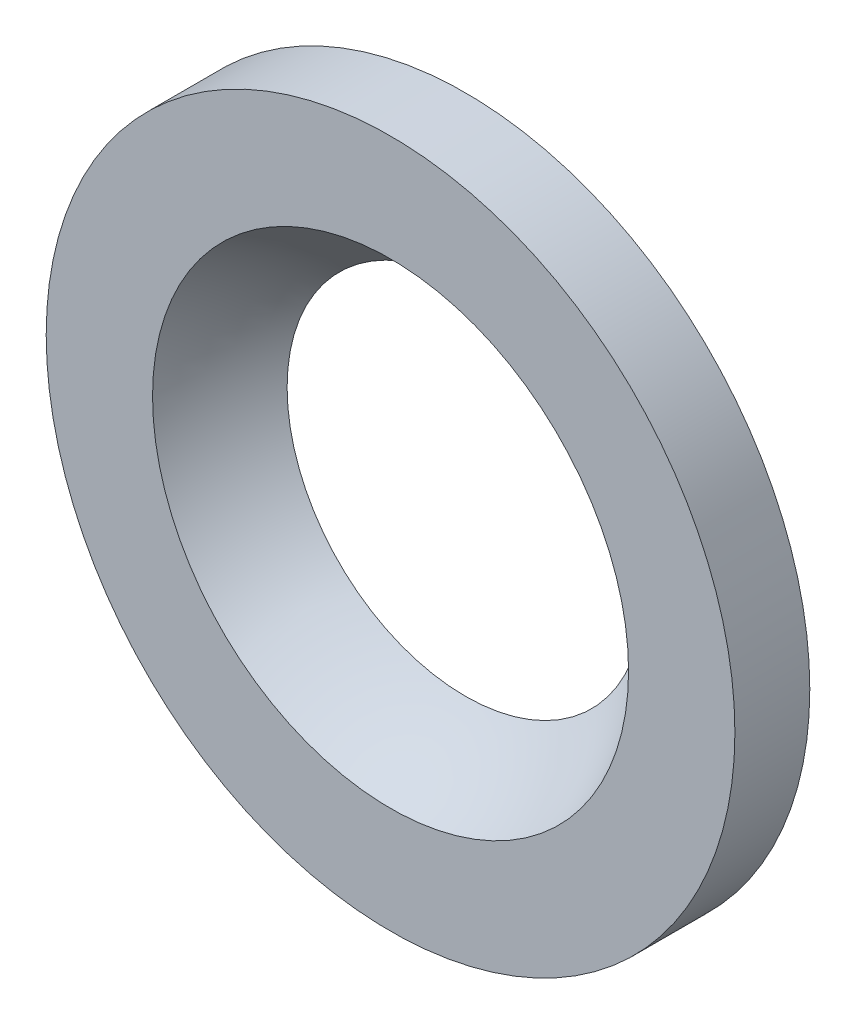
ISO-10303-21;
HEADER;
FILE_DESCRIPTION(('STEP AP214'),'2;1');
FILE_NAME('part.step','',(''),(''),'','','');
FILE_SCHEMA(('AUTOMOTIVE_DESIGN { 1 0 10303 214 1 1 1 1 }'));
ENDSEC;
DATA;
#1=APPLICATION_CONTEXT('core data for automotive mechanical design processes');
#2=APPLICATION_PROTOCOL_DEFINITION('international standard','automotive_design',2000,#1);
#3=PRODUCT_CONTEXT('',#1,'mechanical');
#4=PRODUCT('Part','Part','',(#3));
#5=PRODUCT_RELATED_PRODUCT_CATEGORY('part','',(#4));
#6=PRODUCT_DEFINITION_FORMATION('','',#4);
#7=PRODUCT_DEFINITION_CONTEXT('part definition',#1,'design');
#8=PRODUCT_DEFINITION('design','',#6,#7);
#9=PRODUCT_DEFINITION_SHAPE('','',#8);
#10=(LENGTH_UNIT() NAMED_UNIT(*) SI_UNIT(.MILLI.,.METRE.));
#11=(NAMED_UNIT(*) PLANE_ANGLE_UNIT() SI_UNIT($,.RADIAN.));
#12=(NAMED_UNIT(*) SI_UNIT($,.STERADIAN.) SOLID_ANGLE_UNIT());
#13=UNCERTAINTY_MEASURE_WITH_UNIT(LENGTH_MEASURE(1.E-05),#10,'distance_accuracy_value','');
#14=(GEOMETRIC_REPRESENTATION_CONTEXT(3) GLOBAL_UNCERTAINTY_ASSIGNED_CONTEXT((#13)) GLOBAL_UNIT_ASSIGNED_CONTEXT((#10,
#11,#12)) REPRESENTATION_CONTEXT('',''));
#15=CARTESIAN_POINT('',(0.,0.,0.));
#16=DIRECTION('',(0.,0.,1.));
#17=DIRECTION('',(1.,0.,0.));
#18=AXIS2_PLACEMENT_3D('',#15,#16,#17);
#19=CARTESIAN_POINT('',(0.,0.,7.));
#20=DIRECTION('',(0.,0.,-1.));
#21=DIRECTION('',(-1.,0.,0.));
#22=AXIS2_PLACEMENT_3D('',#19,#20,#21);
#23=CYLINDRICAL_SURFACE('',#22,32.1835643877629);
#24=CARTESIAN_POINT('',(0.,0.,7.));
#25=DIRECTION('',(0.,0.,1.));
#26=DIRECTION('',(1.,0.,0.));
#27=AXIS2_PLACEMENT_3D('',#24,#25,#26);
#28=CIRCLE('',#27,32.1835643877629);
#29=CARTESIAN_POINT('',(32.1835643877629,0.,7.));
#30=VERTEX_POINT('',#29);
#31=EDGE_CURVE('E10',#30,#30,#28,.T.);
#32=ORIENTED_EDGE('',*,*,#31,.F.);
#33=EDGE_LOOP('',(#32));
#34=FACE_BOUND('',#33,.T.);
#35=CARTESIAN_POINT('',(0.,0.,0.));
#36=DIRECTION('',(0.,0.,1.));
#37=DIRECTION('',(1.,0.,0.));
#38=AXIS2_PLACEMENT_3D('',#35,#36,#37);
#39=CIRCLE('',#38,32.1835643877629);
#40=CARTESIAN_POINT('',(32.1835643877629,0.,0.));
#41=VERTEX_POINT('',#40);
#42=EDGE_CURVE('E51',#41,#41,#39,.T.);
#43=ORIENTED_EDGE('',*,*,#42,.T.);
#44=EDGE_LOOP('',(#43));
#45=FACE_BOUND('',#44,.T.);
#46=ADVANCED_FACE('F43',(#34,#45),#23,.T.);
#47=CARTESIAN_POINT('',(0.,0.,7.));
#48=DIRECTION('',(0.,0.,1.));
#49=DIRECTION('',(1.,0.,0.));
#50=AXIS2_PLACEMENT_3D('',#47,#48,#49);
#51=PLANE('',#50);
#52=CARTESIAN_POINT('',(0.,0.,6.99999999999992));
#53=DIRECTION('',(0.,0.,-1.));
#54=DIRECTION('',(-1.,0.,0.));
#55=AXIS2_PLACEMENT_3D('',#52,#53,#54);
#56=CIRCLE('',#55,22.2448581790334);
#57=CARTESIAN_POINT('',(-22.2448581790334,0.,7.));
#58=VERTEX_POINT('',#57);
#59=EDGE_CURVE('E58',#58,#58,#56,.T.);
#60=ORIENTED_EDGE('',*,*,#59,.T.);
#61=EDGE_LOOP('',(#60));
#62=FACE_BOUND('',#61,.T.);
#63=ORIENTED_EDGE('',*,*,#31,.T.);
#64=EDGE_LOOP('',(#63));
#65=FACE_BOUND('',#64,.T.);
#66=ADVANCED_FACE('F77',(#62,#65),#51,.T.);
#67=CARTESIAN_POINT('',(0.,0.,0.));
#68=DIRECTION('',(0.,0.,1.));
#69=DIRECTION('',(1.,0.,0.));
#70=AXIS2_PLACEMENT_3D('',#67,#68,#69);
#71=PLANE('',#70);
#72=CARTESIAN_POINT('',(0.,0.,0.));
#73=DIRECTION('',(0.,0.,1.));
#74=DIRECTION('',(1.,0.,0.));
#75=AXIS2_PLACEMENT_3D('',#72,#73,#74);
#76=CIRCLE('',#75,16.6683447110177);
#77=CARTESIAN_POINT('',(-16.6683447110177,0.,0.));
#78=VERTEX_POINT('',#77);
#79=EDGE_CURVE('E46',#78,#78,#76,.T.);
#80=ORIENTED_EDGE('',*,*,#79,.T.);
#81=EDGE_LOOP('',(#80));
#82=FACE_BOUND('',#81,.T.);
#83=ORIENTED_EDGE('',*,*,#42,.F.);
#84=EDGE_LOOP('',(#83));
#85=FACE_BOUND('',#84,.T.);
#86=ADVANCED_FACE('F67',(#82,#85),#71,.F.);
#87=CARTESIAN_POINT('',(0.,0.,19.));
#88=DIRECTION('',(0.,0.,-1.));
#89=DIRECTION('',(-1.,0.,0.));
#90=AXIS2_PLACEMENT_3D('',#87,#88,#89);
#91=SPHERICAL_SURFACE('',#90,25.2751600470761);
#92=CARTESIAN_POINT('',(-22.2448581790334,0.,7.));
#93=CARTESIAN_POINT('',(-22.2003622000633,0.,6.91751605606863));
#94=CARTESIAN_POINT('',(-22.1554074056388,0.,6.83527962087339));
#95=CARTESIAN_POINT('',(-22.0645858376836,0.,6.67131189476582));
#96=CARTESIAN_POINT('',(-22.018719064153,0.,6.58958060385348));
#97=CARTESIAN_POINT('',(-21.9260791897881,0.,6.42663329312235));
#98=CARTESIAN_POINT('',(-21.8793060889538,0.,6.34541727330355));
#99=CARTESIAN_POINT('',(-21.7848593541734,0.,6.18351055106053));
#100=CARTESIAN_POINT('',(-21.7371857202272,0.,6.10281984863632));
#101=CARTESIAN_POINT('',(-21.640943816746,0.,5.94197374696749));
#102=CARTESIAN_POINT('',(-21.5923755472111,0.,5.86181834772288));
#103=CARTESIAN_POINT('',(-21.4943503829505,0.,5.70205277075622));
#104=CARTESIAN_POINT('',(-21.444893488225,0.,5.62244259303417));
#105=CARTESIAN_POINT('',(-21.3450971933602,0.,5.46377731031098));
#106=CARTESIAN_POINT('',(-21.294757793221,0.,5.38472220530982));
#107=CARTESIAN_POINT('',(-21.1932027166646,0.,5.22717685045454));
#108=CARTESIAN_POINT('',(-21.1419870402475,0.,5.1486866006004));
#109=CARTESIAN_POINT('',(-21.0386857486618,0.,4.99228066859205));
#110=CARTESIAN_POINT('',(-20.9866001334931,0.,4.91436498643783));
#111=CARTESIAN_POINT('',(-20.8815654095897,0.,4.7591178312778));
#112=CARTESIAN_POINT('',(-20.828616300855,0.,4.68178635827199));
#113=CARTESIAN_POINT('',(-20.7218611418527,0.,4.52771719056766));
#114=CARTESIAN_POINT('',(-20.668055091585,0.,4.45097949586915));
#115=CARTESIAN_POINT('',(-20.5595927075903,0.,4.29810738046248));
#116=CARTESIAN_POINT('',(-20.5049363738633,0.,4.22197295975433));
#117=CARTESIAN_POINT('',(-20.394780186239,0.,4.07031681336119));
#118=CARTESIAN_POINT('',(-20.3392803323418,0.,3.9947950876762));
#119=CARTESIAN_POINT('',(-20.2274439720455,0.,3.84437367654599));
#120=CARTESIAN_POINT('',(-20.1711074656464,0.,3.76947399110077));
#121=CARTESIAN_POINT('',(-20.0576047715437,0.,3.62030592869414));
#122=CARTESIAN_POINT('',(-20.0004385838401,0.,3.54603755173273));
#123=CARTESIAN_POINT('',(-19.8852836009921,0.,3.39814129641834));
#124=CARTESIAN_POINT('',(-19.8272948058478,0.,3.32451341806536));
#125=CARTESIAN_POINT('',(-19.7105017837736,0.,3.1779072708358));
#126=CARTESIAN_POINT('',(-19.6516975568437,0.,3.10492900195922));
#127=CARTESIAN_POINT('',(-19.5332809477565,0.,2.95963110416638));
#128=CARTESIAN_POINT('',(-19.4736685655992,0.,2.88731147525013));
#129=CARTESIAN_POINT('',(-19.3536430226184,0.,2.74333980636041));
#130=CARTESIAN_POINT('',(-19.2932298617949,0.,2.67168776638693));
#131=CARTESIAN_POINT('',(-19.1716102371328,0.,2.52906014175635));
#132=CARTESIAN_POINT('',(-19.1104037732941,0.,2.45808455709923));
#133=CARTESIAN_POINT('',(-18.9872051164178,0.,2.31681862576897));
#134=CARTESIAN_POINT('',(-18.9252129233802,0.,2.24652827909583));
#135=CARTESIAN_POINT('',(-18.8004504791498,0.,2.10664152160826));
#136=CARTESIAN_POINT('',(-18.737680227957,0.,2.03704511079385));
#137=CARTESIAN_POINT('',(-18.6113694347388,0.,1.89855483702962));
#138=CARTESIAN_POINT('',(-18.5478288927132,0.,1.82966097407982));
#139=CARTESIAN_POINT('',(-18.4199853804697,0.,1.69258432111525));
#140=CARTESIAN_POINT('',(-18.3556824102516,0.,1.6244015311005));
#141=CARTESIAN_POINT('',(-18.2263219986056,0.,1.48875546108938));
#142=CARTESIAN_POINT('',(-18.1612645571776,0.,1.42129218109301));
#143=CARTESIAN_POINT('',(-18.0304032534625,0.,1.28709347915882));
#144=CARTESIAN_POINT('',(-17.9645993911754,0.,1.22035805722099));
#145=CARTESIAN_POINT('',(-17.8322533884247,0.,1.08762332941287));
#146=CARTESIAN_POINT('',(-17.7657112479612,0.,1.02162402354257));
#147=CARTESIAN_POINT('',(-17.6318969230155,0.,0.890369694657332));
#148=CARTESIAN_POINT('',(-17.5646247385333,0.,0.82511467164239));
#149=CARTESIAN_POINT('',(-17.4293586496011,0.,0.695356983651549));
#150=CARTESIAN_POINT('',(-17.3613647451511,0.,0.63085431867565));
#151=CARTESIAN_POINT('',(-17.2246636312987,0.,0.502609327000912));
#152=CARTESIAN_POINT('',(-17.1559564218962,0.,0.438867000302074));
#153=CARTESIAN_POINT('',(-17.0178371952347,0.,0.312150578227865));
#154=CARTESIAN_POINT('',(-16.9484251779757,0.,0.249176482852494));
#155=CARTESIAN_POINT('',(-16.8089049429951,0.,0.124004295679433));
#156=CARTESIAN_POINT('',(-16.7387967252735,0.,0.0618062038817423));
#157=CARTESIAN_POINT('',(-16.6683447110177,0.,0.));
#158=B_SPLINE_CURVE_WITH_KNOTS('',3,(#92,#93,#94,#95,#96,#97,#98,#99,#100,#101,#102,#103,#104,
#105,#106,#107,#108,#109,#110,#111,#112,#113,#114,#115,#116,#117,#118,#119,#120,#121,#122,#123,
#124,#125,#126,#127,#128,#129,#130,#131,#132,#133,#134,#135,#136,#137,#138,#139,#140,#141,#142,
#143,#144,#145,#146,#147,#148,#149,#150,#151,#152,#153,#154,#155,#156,#157),.UNSPECIFIED.,.F.,
.F.,(4,2,2,2,2,2,2,2,2,2,2,2,2,2,2,2,2,2,2,2,2,2,2,2,2,2,2,2,2,2,2,2,4),(0.,0.281159425889754,
0.562318851779508,0.843478277669264,1.12463770355902,1.40579712944878,1.68695655533853,
1.96811598122829,2.24927540711804,2.53043483300779,2.81159425889755,3.09275368478731,
3.37391311067706,3.65507253656681,3.93623196245657,4.21739138834633,4.49855081423608,
4.77971024012583,5.06086966601559,5.34202909190534,5.6231885177951,5.90434794368485,
6.18550736957461,6.46666679546437,6.74782622135412,7.02898564724388,7.31014507313363,
7.59130449902339,7.87246392491314,8.1536233508029,8.43478277669265,8.71594220258241,
8.99710162847216),.UNSPECIFIED.);
#159=EDGE_CURVE('BSEAM70',#58,#78,#158,.T.);
#160=ORIENTED_EDGE('',*,*,#59,.F.);
#161=ORIENTED_EDGE('',*,*,#79,.F.);
#162=ORIENTED_EDGE('',*,*,#159,.T.);
#163=ORIENTED_EDGE('',*,*,#159,.F.);
#164=EDGE_LOOP('',(#160,#162,#161,#163));
#165=FACE_BOUND('',#164,.T.);
#166=ADVANCED_FACE('F70',(#165),#91,.F.);
#167=CLOSED_SHELL('',(#46,#66,#86,#166));
#168=MANIFOLD_SOLID_BREP('B2',#167);
#169=ADVANCED_BREP_SHAPE_REPRESENTATION('',(#18,#168),#14);
#170=SHAPE_DEFINITION_REPRESENTATION(#9,#169);
ENDSEC;
END-ISO-10303-21;
